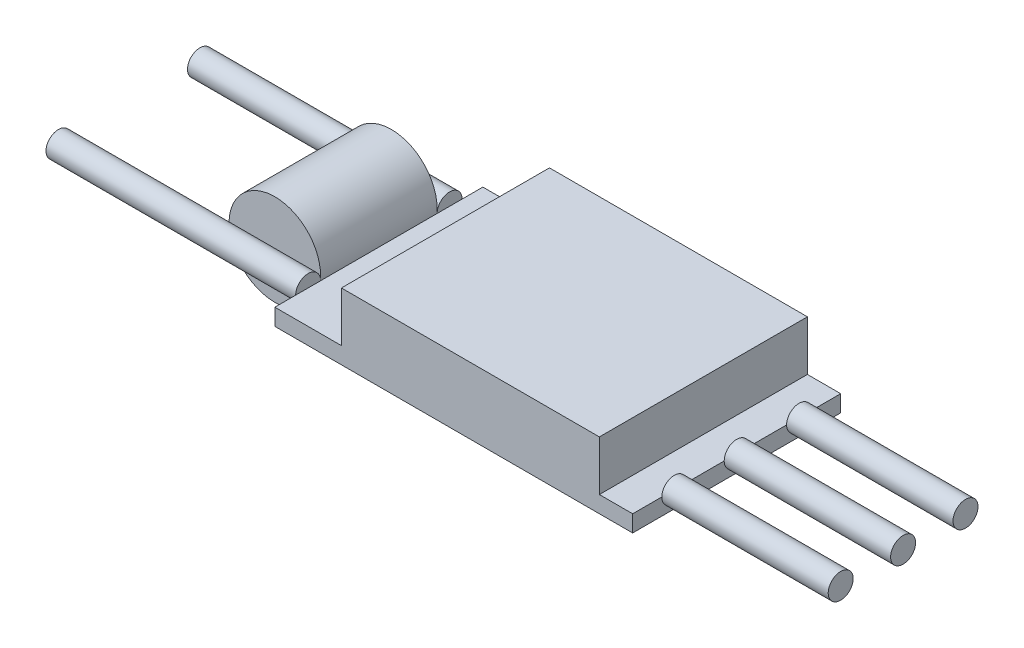
ISO-10303-21;
HEADER;
FILE_DESCRIPTION(('STEP AP214'),'2;1');
FILE_NAME('part.step','',(''),(''),'','','');
FILE_SCHEMA(('AUTOMOTIVE_DESIGN { 1 0 10303 214 1 1 1 1 }'));
ENDSEC;
DATA;
#1=APPLICATION_CONTEXT('core data for automotive mechanical design processes');
#2=APPLICATION_PROTOCOL_DEFINITION('international standard','automotive_design',2000,#1);
#3=PRODUCT_CONTEXT('',#1,'mechanical');
#4=PRODUCT('Part','Part','',(#3));
#5=PRODUCT_RELATED_PRODUCT_CATEGORY('part','',(#4));
#6=PRODUCT_DEFINITION_FORMATION('','',#4);
#7=PRODUCT_DEFINITION_CONTEXT('part definition',#1,'design');
#8=PRODUCT_DEFINITION('design','',#6,#7);
#9=PRODUCT_DEFINITION_SHAPE('','',#8);
#10=(LENGTH_UNIT() NAMED_UNIT(*) SI_UNIT(.MILLI.,.METRE.));
#11=(NAMED_UNIT(*) PLANE_ANGLE_UNIT() SI_UNIT($,.RADIAN.));
#12=(NAMED_UNIT(*) SI_UNIT($,.STERADIAN.) SOLID_ANGLE_UNIT());
#13=UNCERTAINTY_MEASURE_WITH_UNIT(LENGTH_MEASURE(1.E-05),#10,'distance_accuracy_value','');
#14=(GEOMETRIC_REPRESENTATION_CONTEXT(3) GLOBAL_UNCERTAINTY_ASSIGNED_CONTEXT((#13)) GLOBAL_UNIT_ASSIGNED_CONTEXT((#10,
#11,#12)) REPRESENTATION_CONTEXT('',''));
#15=CARTESIAN_POINT('',(0.,0.,0.));
#16=DIRECTION('',(0.,0.,1.));
#17=DIRECTION('',(1.,0.,0.));
#18=AXIS2_PLACEMENT_3D('',#15,#16,#17);
#19=CARTESIAN_POINT('',(-27.,2.5,7.));
#20=DIRECTION('',(0.,0.,-1.));
#21=DIRECTION('',(-1.,0.,0.));
#22=AXIS2_PLACEMENT_3D('',#19,#20,#21);
#23=CYLINDRICAL_SURFACE('',#22,5.5);
#24=CARTESIAN_POINT('',(-27.,2.5,7.));
#25=DIRECTION('',(0.,0.,1.));
#26=DIRECTION('',(1.,0.,0.));
#27=AXIS2_PLACEMENT_3D('',#24,#25,#26);
#28=CIRCLE('',#27,5.5);
#29=CARTESIAN_POINT('',(-21.5,2.5,7.));
#30=VERTEX_POINT('',#29);
#31=EDGE_CURVE('E11',#30,#30,#28,.T.);
#32=ORIENTED_EDGE('',*,*,#31,.F.);
#33=EDGE_LOOP('',(#32));
#34=FACE_BOUND('',#33,.T.);
#35=CARTESIAN_POINT('',(-27.,2.5,-7.));
#36=DIRECTION('',(0.,0.,1.));
#37=DIRECTION('',(1.,0.,0.));
#38=AXIS2_PLACEMENT_3D('',#35,#36,#37);
#39=CIRCLE('',#38,5.5);
#40=CARTESIAN_POINT('',(-21.5,2.5,-7.));
#41=VERTEX_POINT('',#40);
#42=EDGE_CURVE('E50',#41,#41,#39,.T.);
#43=ORIENTED_EDGE('',*,*,#42,.T.);
#44=EDGE_LOOP('',(#43));
#45=FACE_BOUND('',#44,.T.);
#46=ADVANCED_FACE('F47',(#34,#45),#23,.T.);
#47=CARTESIAN_POINT('',(-27.,2.5,7.));
#48=DIRECTION('',(0.,0.,1.));
#49=DIRECTION('',(1.,0.,0.));
#50=AXIS2_PLACEMENT_3D('',#47,#48,#49);
#51=PLANE('',#50);
#52=ORIENTED_EDGE('',*,*,#31,.T.);
#53=EDGE_LOOP('',(#52));
#54=FACE_BOUND('',#53,.T.);
#55=ADVANCED_FACE('F62',(#54),#51,.T.);
#56=CARTESIAN_POINT('',(-27.,2.5,-7.));
#57=DIRECTION('',(0.,0.,1.));
#58=DIRECTION('',(1.,0.,0.));
#59=AXIS2_PLACEMENT_3D('',#56,#57,#58);
#60=PLANE('',#59);
#61=ORIENTED_EDGE('',*,*,#42,.F.);
#62=EDGE_LOOP('',(#61));
#63=FACE_BOUND('',#62,.T.);
#64=ADVANCED_FACE('F60',(#63),#60,.F.);
#65=CLOSED_SHELL('',(#46,#55,#64));
#66=MANIFOLD_SOLID_BREP('B2',#65);
#67=CARTESIAN_POINT('',(21.5,2.,12.5));
#68=DIRECTION('',(-1.,0.,0.));
#69=DIRECTION('',(0.,0.,1.));
#70=AXIS2_PLACEMENT_3D('',#67,#68,#69);
#71=PLANE('',#70);
#72=CARTESIAN_POINT('',(21.5,2.,-7.5));
#73=DIRECTION('',(1.,0.,0.));
#74=DIRECTION('',(0.,0.,-1.));
#75=AXIS2_PLACEMENT_3D('',#72,#73,#74);
#76=CIRCLE('',#75,1.5);
#77=CARTESIAN_POINT('',(21.5,2.,-6.));
#78=VERTEX_POINT('',#77);
#79=CARTESIAN_POINT('',(21.5,2.,-9.00000000000001));
#80=VERTEX_POINT('',#79);
#81=EDGE_CURVE('E194',#78,#80,#76,.T.);
#82=ORIENTED_EDGE('',*,*,#81,.F.);
#83=DIRECTION('',(0.,0.,-1.));
#84=VECTOR('',#83,1.);
#85=CARTESIAN_POINT('',(21.5,2.,12.5));
#86=LINE('',#85,#84);
#87=CARTESIAN_POINT('',(21.5,2.,-1.5));
#88=VERTEX_POINT('',#87);
#89=EDGE_CURVE('E188',#88,#78,#86,.T.);
#90=ORIENTED_EDGE('',*,*,#89,.F.);
#91=CARTESIAN_POINT('',(21.5,2.,0.));
#92=DIRECTION('',(1.,0.,0.));
#93=DIRECTION('',(0.,0.,-1.));
#94=AXIS2_PLACEMENT_3D('',#91,#92,#93);
#95=CIRCLE('',#94,1.5);
#96=CARTESIAN_POINT('',(21.5,2.,1.5));
#97=VERTEX_POINT('',#96);
#98=EDGE_CURVE('E319',#97,#88,#95,.T.);
#99=ORIENTED_EDGE('',*,*,#98,.F.);
#100=CARTESIAN_POINT('',(21.5,2.,6.));
#101=VERTEX_POINT('',#100);
#102=EDGE_CURVE('E206',#101,#97,#86,.T.);
#103=ORIENTED_EDGE('',*,*,#102,.F.);
#104=CARTESIAN_POINT('',(21.5,2.,7.5));
#105=DIRECTION('',(1.,0.,0.));
#106=DIRECTION('',(0.,0.,-1.));
#107=AXIS2_PLACEMENT_3D('',#104,#105,#106);
#108=CIRCLE('',#107,1.5);
#109=CARTESIAN_POINT('',(21.5,2.,9.00000000000001));
#110=VERTEX_POINT('',#109);
#111=EDGE_CURVE('E45',#110,#101,#108,.T.);
#112=ORIENTED_EDGE('',*,*,#111,.F.);
#113=CARTESIAN_POINT('',(21.5,2.,12.5));
#114=VERTEX_POINT('',#113);
#115=EDGE_CURVE('E207',#114,#110,#86,.T.);
#116=ORIENTED_EDGE('',*,*,#115,.F.);
#117=DIRECTION('',(0.,-1.,0.));
#118=VECTOR('',#117,1.);
#119=CARTESIAN_POINT('',(21.5,2.,12.5));
#120=LINE('',#119,#118);
#121=CARTESIAN_POINT('',(21.5,0.,12.5));
#122=VERTEX_POINT('',#121);
#123=EDGE_CURVE('E234',#114,#122,#120,.T.);
#124=ORIENTED_EDGE('',*,*,#123,.T.);
#125=DIRECTION('',(0.,0.,-1.));
#126=VECTOR('',#125,1.);
#127=CARTESIAN_POINT('',(21.5,0.,12.5));
#128=LINE('',#127,#126);
#129=CARTESIAN_POINT('',(21.5,0.,-12.5));
#130=VERTEX_POINT('',#129);
#131=EDGE_CURVE('E245',#122,#130,#128,.T.);
#132=ORIENTED_EDGE('',*,*,#131,.T.);
#133=DIRECTION('',(0.,-1.,0.));
#134=VECTOR('',#133,1.);
#135=CARTESIAN_POINT('',(21.5,2.,-12.5));
#136=LINE('',#135,#134);
#137=CARTESIAN_POINT('',(21.5,2.,-12.5));
#138=VERTEX_POINT('',#137);
#139=EDGE_CURVE('E237',#138,#130,#136,.T.);
#140=ORIENTED_EDGE('',*,*,#139,.F.);
#141=EDGE_CURVE('E189',#80,#138,#86,.T.);
#142=ORIENTED_EDGE('',*,*,#141,.F.);
#143=EDGE_LOOP('',(#82,#90,#99,#103,#112,#116,#124,#132,#140,#142));
#144=FACE_BOUND('',#143,.T.);
#145=ADVANCED_FACE('F88',(#144),#71,.F.);
#146=CARTESIAN_POINT('',(-21.5,2.,12.5));
#147=DIRECTION('',(1.,0.,0.));
#148=DIRECTION('',(0.,0.,-1.));
#149=AXIS2_PLACEMENT_3D('',#146,#147,#148);
#150=PLANE('',#149);
#151=CARTESIAN_POINT('',(-21.5,2.,8.5));
#152=DIRECTION('',(-1.,0.,0.));
#153=DIRECTION('',(0.,0.,1.));
#154=AXIS2_PLACEMENT_3D('',#151,#152,#153);
#155=CIRCLE('',#154,1.5);
#156=CARTESIAN_POINT('',(-21.5,2.,7.));
#157=VERTEX_POINT('',#156);
#158=CARTESIAN_POINT('',(-21.5,2.,10.));
#159=VERTEX_POINT('',#158);
#160=EDGE_CURVE('E310',#157,#159,#155,.T.);
#161=ORIENTED_EDGE('',*,*,#160,.F.);
#162=DIRECTION('',(0.,0.,1.));
#163=VECTOR('',#162,1.);
#164=CARTESIAN_POINT('',(-21.5,2.,12.5));
#165=LINE('',#164,#163);
#166=CARTESIAN_POINT('',(-21.5,2.,-7.));
#167=VERTEX_POINT('',#166);
#168=EDGE_CURVE('E351',#167,#157,#165,.T.);
#169=ORIENTED_EDGE('',*,*,#168,.F.);
#170=CARTESIAN_POINT('',(-21.5,2.,-8.5));
#171=DIRECTION('',(-1.,0.,0.));
#172=DIRECTION('',(0.,0.,1.));
#173=AXIS2_PLACEMENT_3D('',#170,#171,#172);
#174=CIRCLE('',#173,1.5);
#175=CARTESIAN_POINT('',(-21.5,2.,-10.));
#176=VERTEX_POINT('',#175);
#177=EDGE_CURVE('E97',#176,#167,#174,.T.);
#178=ORIENTED_EDGE('',*,*,#177,.F.);
#179=CARTESIAN_POINT('',(-21.5,2.,-12.5));
#180=VERTEX_POINT('',#179);
#181=EDGE_CURVE('E229',#180,#176,#165,.T.);
#182=ORIENTED_EDGE('',*,*,#181,.F.);
#183=DIRECTION('',(0.,-1.,0.));
#184=VECTOR('',#183,1.);
#185=CARTESIAN_POINT('',(-21.5,2.,-12.5));
#186=LINE('',#185,#184);
#187=CARTESIAN_POINT('',(-21.5,0.,-12.5));
#188=VERTEX_POINT('',#187);
#189=EDGE_CURVE('E225',#180,#188,#186,.T.);
#190=ORIENTED_EDGE('',*,*,#189,.T.);
#191=DIRECTION('',(0.,0.,1.));
#192=VECTOR('',#191,1.);
#193=CARTESIAN_POINT('',(-21.5,0.,12.5));
#194=LINE('',#193,#192);
#195=CARTESIAN_POINT('',(-21.5,0.,12.5));
#196=VERTEX_POINT('',#195);
#197=EDGE_CURVE('E217',#188,#196,#194,.T.);
#198=ORIENTED_EDGE('',*,*,#197,.T.);
#199=DIRECTION('',(0.,-1.,0.));
#200=VECTOR('',#199,1.);
#201=CARTESIAN_POINT('',(-21.5,2.,12.5));
#202=LINE('',#201,#200);
#203=CARTESIAN_POINT('',(-21.5,2.,12.5));
#204=VERTEX_POINT('',#203);
#205=EDGE_CURVE('E231',#204,#196,#202,.T.);
#206=ORIENTED_EDGE('',*,*,#205,.F.);
#207=EDGE_CURVE('E244',#159,#204,#165,.T.);
#208=ORIENTED_EDGE('',*,*,#207,.F.);
#209=EDGE_LOOP('',(#161,#169,#178,#182,#190,#198,#206,#208));
#210=FACE_BOUND('',#209,.T.);
#211=ADVANCED_FACE('F90',(#210),#150,.F.);
#212=CARTESIAN_POINT('',(0.,2.,0.));
#213=DIRECTION('',(0.,1.,0.));
#214=DIRECTION('',(0.,0.,1.));
#215=AXIS2_PLACEMENT_3D('',#212,#213,#214);
#216=PLANE('',#215);
#217=DIRECTION('',(0.,0.,1.));
#218=VECTOR('',#217,1.);
#219=CARTESIAN_POINT('',(-13.5,2.,-12.5));
#220=LINE('',#219,#218);
#221=CARTESIAN_POINT('',(-13.5,2.,-12.5));
#222=VERTEX_POINT('',#221);
#223=CARTESIAN_POINT('',(-13.5,2.,12.5));
#224=VERTEX_POINT('',#223);
#225=EDGE_CURVE('E268',#222,#224,#220,.T.);
#226=ORIENTED_EDGE('',*,*,#225,.F.);
#227=DIRECTION('',(-1.,0.,0.));
#228=VECTOR('',#227,1.);
#229=CARTESIAN_POINT('',(21.5,2.,-12.5));
#230=LINE('',#229,#228);
#231=EDGE_CURVE('E211',#222,#180,#230,.T.);
#232=ORIENTED_EDGE('',*,*,#231,.T.);
#233=ORIENTED_EDGE('',*,*,#181,.T.);
#234=EDGE_CURVE('E350',#176,#167,#165,.T.);
#235=ORIENTED_EDGE('',*,*,#234,.T.);
#236=ORIENTED_EDGE('',*,*,#168,.T.);
#237=EDGE_CURVE('E352',#157,#159,#165,.T.);
#238=ORIENTED_EDGE('',*,*,#237,.T.);
#239=ORIENTED_EDGE('',*,*,#207,.T.);
#240=DIRECTION('',(1.,0.,0.));
#241=VECTOR('',#240,1.);
#242=CARTESIAN_POINT('',(21.5,2.,12.5));
#243=LINE('',#242,#241);
#244=EDGE_CURVE('E228',#204,#224,#243,.T.);
#245=ORIENTED_EDGE('',*,*,#244,.T.);
#246=EDGE_LOOP('',(#226,#232,#233,#235,#236,#238,#239,#245));
#247=FACE_BOUND('',#246,.T.);
#248=ADVANCED_FACE('F356',(#247),#216,.T.);
#249=CARTESIAN_POINT('',(21.5,2.,12.5));
#250=DIRECTION('',(0.,0.,-1.));
#251=DIRECTION('',(-1.,0.,0.));
#252=AXIS2_PLACEMENT_3D('',#249,#250,#251);
#253=PLANE('',#252);
#254=DIRECTION('',(1.,0.,0.));
#255=VECTOR('',#254,1.);
#256=CARTESIAN_POINT('',(21.5,0.,12.5));
#257=LINE('',#256,#255);
#258=EDGE_CURVE('E246',#196,#122,#257,.T.);
#259=ORIENTED_EDGE('',*,*,#258,.T.);
#260=ORIENTED_EDGE('',*,*,#123,.F.);
#261=CARTESIAN_POINT('',(17.5,2.,12.5));
#262=VERTEX_POINT('',#261);
#263=EDGE_CURVE('E226',#262,#114,#243,.T.);
#264=ORIENTED_EDGE('',*,*,#263,.F.);
#265=DIRECTION('',(0.,-1.,0.));
#266=VECTOR('',#265,1.);
#267=CARTESIAN_POINT('',(17.5,8.,12.5));
#268=LINE('',#267,#266);
#269=CARTESIAN_POINT('',(17.5,8.,12.5));
#270=VERTEX_POINT('',#269);
#271=EDGE_CURVE('E255',#270,#262,#268,.T.);
#272=ORIENTED_EDGE('',*,*,#271,.F.);
#273=DIRECTION('',(1.,0.,0.));
#274=VECTOR('',#273,1.);
#275=CARTESIAN_POINT('',(-13.5,8.,12.5));
#276=LINE('',#275,#274);
#277=CARTESIAN_POINT('',(-13.5,8.,12.5));
#278=VERTEX_POINT('',#277);
#279=EDGE_CURVE('E296',#278,#270,#276,.T.);
#280=ORIENTED_EDGE('',*,*,#279,.F.);
#281=DIRECTION('',(0.,-1.,0.));
#282=VECTOR('',#281,1.);
#283=CARTESIAN_POINT('',(-13.5,8.,12.5));
#284=LINE('',#283,#282);
#285=EDGE_CURVE('E250',#278,#224,#284,.T.);
#286=ORIENTED_EDGE('',*,*,#285,.T.);
#287=ORIENTED_EDGE('',*,*,#244,.F.);
#288=ORIENTED_EDGE('',*,*,#205,.T.);
#289=EDGE_LOOP('',(#259,#260,#264,#272,#280,#286,#287,#288));
#290=FACE_BOUND('',#289,.T.);
#291=ADVANCED_FACE('F384',(#290),#253,.F.);
#292=CARTESIAN_POINT('',(21.5,2.,-12.5));
#293=DIRECTION('',(0.,0.,1.));
#294=DIRECTION('',(1.,0.,0.));
#295=AXIS2_PLACEMENT_3D('',#292,#293,#294);
#296=PLANE('',#295);
#297=DIRECTION('',(-1.,0.,0.));
#298=VECTOR('',#297,1.);
#299=CARTESIAN_POINT('',(21.5,0.,-12.5));
#300=LINE('',#299,#298);
#301=EDGE_CURVE('E242',#130,#188,#300,.T.);
#302=ORIENTED_EDGE('',*,*,#301,.T.);
#303=ORIENTED_EDGE('',*,*,#189,.F.);
#304=ORIENTED_EDGE('',*,*,#231,.F.);
#305=DIRECTION('',(0.,-1.,0.));
#306=VECTOR('',#305,1.);
#307=CARTESIAN_POINT('',(-13.5,8.,-12.5));
#308=LINE('',#307,#306);
#309=CARTESIAN_POINT('',(-13.5,8.,-12.5));
#310=VERTEX_POINT('',#309);
#311=EDGE_CURVE('E272',#310,#222,#308,.T.);
#312=ORIENTED_EDGE('',*,*,#311,.F.);
#313=DIRECTION('',(-1.,0.,0.));
#314=VECTOR('',#313,1.);
#315=CARTESIAN_POINT('',(-13.5,8.,-12.5));
#316=LINE('',#315,#314);
#317=CARTESIAN_POINT('',(17.5,8.,-12.5));
#318=VERTEX_POINT('',#317);
#319=EDGE_CURVE('E276',#318,#310,#316,.T.);
#320=ORIENTED_EDGE('',*,*,#319,.F.);
#321=DIRECTION('',(0.,-1.,0.));
#322=VECTOR('',#321,1.);
#323=CARTESIAN_POINT('',(17.5,8.,-12.5));
#324=LINE('',#323,#322);
#325=CARTESIAN_POINT('',(17.5,2.,-12.5));
#326=VERTEX_POINT('',#325);
#327=EDGE_CURVE('E261',#318,#326,#324,.T.);
#328=ORIENTED_EDGE('',*,*,#327,.T.);
#329=EDGE_CURVE('E223',#138,#326,#230,.T.);
#330=ORIENTED_EDGE('',*,*,#329,.F.);
#331=ORIENTED_EDGE('',*,*,#139,.T.);
#332=EDGE_LOOP('',(#302,#303,#304,#312,#320,#328,#330,#331));
#333=FACE_BOUND('',#332,.T.);
#334=ADVANCED_FACE('F341',(#333),#296,.F.);
#335=DIRECTION('',(0.,0.,-1.));
#336=VECTOR('',#335,1.);
#337=CARTESIAN_POINT('',(17.5,2.,-12.5));
#338=LINE('',#337,#336);
#339=EDGE_CURVE('E270',#262,#326,#338,.T.);
#340=ORIENTED_EDGE('',*,*,#339,.F.);
#341=ORIENTED_EDGE('',*,*,#263,.T.);
#342=ORIENTED_EDGE('',*,*,#115,.T.);
#343=EDGE_CURVE('E212',#110,#101,#86,.T.);
#344=ORIENTED_EDGE('',*,*,#343,.T.);
#345=ORIENTED_EDGE('',*,*,#102,.T.);
#346=EDGE_CURVE('E205',#97,#88,#86,.T.);
#347=ORIENTED_EDGE('',*,*,#346,.T.);
#348=ORIENTED_EDGE('',*,*,#89,.T.);
#349=EDGE_CURVE('E184',#78,#80,#86,.T.);
#350=ORIENTED_EDGE('',*,*,#349,.T.);
#351=ORIENTED_EDGE('',*,*,#141,.T.);
#352=ORIENTED_EDGE('',*,*,#329,.T.);
#353=EDGE_LOOP('',(#340,#341,#342,#344,#345,#347,#348,#350,#351,#352));
#354=FACE_BOUND('',#353,.T.);
#355=ADVANCED_FACE('F203',(#354),#216,.T.);
#356=CARTESIAN_POINT('',(0.,0.,0.));
#357=DIRECTION('',(0.,1.,0.));
#358=DIRECTION('',(0.,0.,1.));
#359=AXIS2_PLACEMENT_3D('',#356,#357,#358);
#360=PLANE('',#359);
#361=ORIENTED_EDGE('',*,*,#197,.F.);
#362=ORIENTED_EDGE('',*,*,#301,.F.);
#363=ORIENTED_EDGE('',*,*,#131,.F.);
#364=ORIENTED_EDGE('',*,*,#258,.F.);
#365=EDGE_LOOP('',(#361,#362,#363,#364));
#366=FACE_BOUND('',#365,.T.);
#367=ADVANCED_FACE('F339',(#366),#360,.F.);
#368=CARTESIAN_POINT('',(-13.5,8.,-12.5));
#369=DIRECTION('',(1.,0.,0.));
#370=DIRECTION('',(0.,0.,-1.));
#371=AXIS2_PLACEMENT_3D('',#368,#369,#370);
#372=PLANE('',#371);
#373=ORIENTED_EDGE('',*,*,#225,.T.);
#374=ORIENTED_EDGE('',*,*,#285,.F.);
#375=DIRECTION('',(0.,0.,1.));
#376=VECTOR('',#375,1.);
#377=CARTESIAN_POINT('',(-13.5,8.,-12.5));
#378=LINE('',#377,#376);
#379=EDGE_CURVE('E281',#310,#278,#378,.T.);
#380=ORIENTED_EDGE('',*,*,#379,.F.);
#381=ORIENTED_EDGE('',*,*,#311,.T.);
#382=EDGE_LOOP('',(#373,#374,#380,#381));
#383=FACE_BOUND('',#382,.T.);
#384=ADVANCED_FACE('F398',(#383),#372,.F.);
#385=CARTESIAN_POINT('',(17.5,8.,-12.5));
#386=DIRECTION('',(-1.,0.,0.));
#387=DIRECTION('',(0.,0.,1.));
#388=AXIS2_PLACEMENT_3D('',#385,#386,#387);
#389=PLANE('',#388);
#390=ORIENTED_EDGE('',*,*,#339,.T.);
#391=ORIENTED_EDGE('',*,*,#327,.F.);
#392=DIRECTION('',(0.,0.,-1.));
#393=VECTOR('',#392,1.);
#394=CARTESIAN_POINT('',(17.5,8.,-12.5));
#395=LINE('',#394,#393);
#396=EDGE_CURVE('E293',#270,#318,#395,.T.);
#397=ORIENTED_EDGE('',*,*,#396,.F.);
#398=ORIENTED_EDGE('',*,*,#271,.T.);
#399=EDGE_LOOP('',(#390,#391,#397,#398));
#400=FACE_BOUND('',#399,.T.);
#401=ADVANCED_FACE('F402',(#400),#389,.F.);
#402=CARTESIAN_POINT('',(0.,8.,0.));
#403=DIRECTION('',(0.,1.,0.));
#404=DIRECTION('',(0.,0.,1.));
#405=AXIS2_PLACEMENT_3D('',#402,#403,#404);
#406=PLANE('',#405);
#407=ORIENTED_EDGE('',*,*,#379,.T.);
#408=ORIENTED_EDGE('',*,*,#279,.T.);
#409=ORIENTED_EDGE('',*,*,#396,.T.);
#410=ORIENTED_EDGE('',*,*,#319,.T.);
#411=EDGE_LOOP('',(#407,#408,#409,#410));
#412=FACE_BOUND('',#411,.T.);
#413=ADVANCED_FACE('F406',(#412),#406,.T.);
#414=CARTESIAN_POINT('',(-51.5,2.,-8.5));
#415=DIRECTION('',(1.,0.,0.));
#416=DIRECTION('',(0.,0.,-1.));
#417=AXIS2_PLACEMENT_3D('',#414,#415,#416);
#418=CYLINDRICAL_SURFACE('',#417,1.5);
#419=CARTESIAN_POINT('',(-51.5,2.,-8.5));
#420=DIRECTION('',(-1.,0.,0.));
#421=DIRECTION('',(0.,0.,1.));
#422=AXIS2_PLACEMENT_3D('',#419,#420,#421);
#423=CIRCLE('',#422,1.5);
#424=CARTESIAN_POINT('',(-51.5,2.,-7.));
#425=VERTEX_POINT('',#424);
#426=EDGE_CURVE('E271',#425,#425,#423,.T.);
#427=ORIENTED_EDGE('',*,*,#426,.F.);
#428=EDGE_LOOP('',(#427));
#429=FACE_BOUND('',#428,.T.);
#430=EDGE_CURVE('E301',#167,#176,#174,.T.);
#431=ORIENTED_EDGE('',*,*,#430,.T.);
#432=ORIENTED_EDGE('',*,*,#177,.T.);
#433=EDGE_LOOP('',(#431,#432));
#434=FACE_BOUND('',#433,.T.);
#435=ADVANCED_FACE('F360',(#429,#434),#418,.T.);
#436=CARTESIAN_POINT('',(-51.5,2.,-8.5));
#437=DIRECTION('',(-1.,0.,0.));
#438=DIRECTION('',(0.,0.,1.));
#439=AXIS2_PLACEMENT_3D('',#436,#437,#438);
#440=PLANE('',#439);
#441=ORIENTED_EDGE('',*,*,#426,.T.);
#442=EDGE_LOOP('',(#441));
#443=FACE_BOUND('',#442,.T.);
#444=ADVANCED_FACE('F365',(#443),#440,.T.);
#445=CARTESIAN_POINT('',(-21.5,2.,-8.5));
#446=DIRECTION('',(-1.,0.,0.));
#447=DIRECTION('',(0.,0.,1.));
#448=AXIS2_PLACEMENT_3D('',#445,#446,#447);
#449=PLANE('',#448);
#450=ORIENTED_EDGE('',*,*,#234,.F.);
#451=ORIENTED_EDGE('',*,*,#430,.F.);
#452=EDGE_LOOP('',(#450,#451));
#453=FACE_BOUND('',#452,.T.);
#454=ADVANCED_FACE('F362',(#453),#449,.F.);
#455=CARTESIAN_POINT('',(-51.5,2.,8.5));
#456=DIRECTION('',(1.,0.,0.));
#457=DIRECTION('',(0.,0.,-1.));
#458=AXIS2_PLACEMENT_3D('',#455,#456,#457);
#459=CYLINDRICAL_SURFACE('',#458,1.5);
#460=CARTESIAN_POINT('',(-51.5,2.,8.5));
#461=DIRECTION('',(-1.,0.,0.));
#462=DIRECTION('',(0.,0.,1.));
#463=AXIS2_PLACEMENT_3D('',#460,#461,#462);
#464=CIRCLE('',#463,1.5);
#465=CARTESIAN_POINT('',(-51.5,2.,10.));
#466=VERTEX_POINT('',#465);
#467=EDGE_CURVE('E304',#466,#466,#464,.T.);
#468=ORIENTED_EDGE('',*,*,#467,.F.);
#469=EDGE_LOOP('',(#468));
#470=FACE_BOUND('',#469,.T.);
#471=EDGE_CURVE('E307',#159,#157,#155,.T.);
#472=ORIENTED_EDGE('',*,*,#471,.T.);
#473=ORIENTED_EDGE('',*,*,#160,.T.);
#474=EDGE_LOOP('',(#472,#473));
#475=FACE_BOUND('',#474,.T.);
#476=ADVANCED_FACE('F364',(#470,#475),#459,.T.);
#477=CARTESIAN_POINT('',(-51.5,2.,8.5));
#478=DIRECTION('',(-1.,0.,0.));
#479=DIRECTION('',(0.,0.,1.));
#480=AXIS2_PLACEMENT_3D('',#477,#478,#479);
#481=PLANE('',#480);
#482=ORIENTED_EDGE('',*,*,#467,.T.);
#483=EDGE_LOOP('',(#482));
#484=FACE_BOUND('',#483,.T.);
#485=ADVANCED_FACE('F371',(#484),#481,.T.);
#486=CARTESIAN_POINT('',(-21.5,2.,8.5));
#487=DIRECTION('',(-1.,0.,0.));
#488=DIRECTION('',(0.,0.,1.));
#489=AXIS2_PLACEMENT_3D('',#486,#487,#488);
#490=PLANE('',#489);
#491=ORIENTED_EDGE('',*,*,#237,.F.);
#492=ORIENTED_EDGE('',*,*,#471,.F.);
#493=EDGE_LOOP('',(#491,#492));
#494=FACE_BOUND('',#493,.T.);
#495=ADVANCED_FACE('F431',(#494),#490,.F.);
#496=CARTESIAN_POINT('',(41.5,2.,7.5));
#497=DIRECTION('',(-1.,0.,0.));
#498=DIRECTION('',(0.,0.,1.));
#499=AXIS2_PLACEMENT_3D('',#496,#497,#498);
#500=CYLINDRICAL_SURFACE('',#499,1.5);
#501=CARTESIAN_POINT('',(41.5,2.,7.5));
#502=DIRECTION('',(1.,0.,0.));
#503=DIRECTION('',(0.,0.,-1.));
#504=AXIS2_PLACEMENT_3D('',#501,#502,#503);
#505=CIRCLE('',#504,1.5);
#506=CARTESIAN_POINT('',(41.5,2.,6.));
#507=VERTEX_POINT('',#506);
#508=EDGE_CURVE('E314',#507,#507,#505,.T.);
#509=ORIENTED_EDGE('',*,*,#508,.F.);
#510=EDGE_LOOP('',(#509));
#511=FACE_BOUND('',#510,.T.);
#512=EDGE_CURVE('E99',#101,#110,#108,.T.);
#513=ORIENTED_EDGE('',*,*,#512,.T.);
#514=ORIENTED_EDGE('',*,*,#111,.T.);
#515=EDGE_LOOP('',(#513,#514));
#516=FACE_BOUND('',#515,.T.);
#517=ADVANCED_FACE('F334',(#511,#516),#500,.T.);
#518=CARTESIAN_POINT('',(41.5,2.,7.5));
#519=DIRECTION('',(1.,0.,0.));
#520=DIRECTION('',(0.,0.,-1.));
#521=AXIS2_PLACEMENT_3D('',#518,#519,#520);
#522=PLANE('',#521);
#523=ORIENTED_EDGE('',*,*,#508,.T.);
#524=EDGE_LOOP('',(#523));
#525=FACE_BOUND('',#524,.T.);
#526=ADVANCED_FACE('F458',(#525),#522,.T.);
#527=CARTESIAN_POINT('',(21.5,2.,7.5));
#528=DIRECTION('',(1.,0.,0.));
#529=DIRECTION('',(0.,0.,-1.));
#530=AXIS2_PLACEMENT_3D('',#527,#528,#529);
#531=PLANE('',#530);
#532=ORIENTED_EDGE('',*,*,#343,.F.);
#533=ORIENTED_EDGE('',*,*,#512,.F.);
#534=EDGE_LOOP('',(#532,#533));
#535=FACE_BOUND('',#534,.T.);
#536=ADVANCED_FACE('F332',(#535),#531,.F.);
#537=CARTESIAN_POINT('',(41.5,2.,0.));
#538=DIRECTION('',(-1.,0.,0.));
#539=DIRECTION('',(0.,0.,1.));
#540=AXIS2_PLACEMENT_3D('',#537,#538,#539);
#541=CYLINDRICAL_SURFACE('',#540,1.5);
#542=CARTESIAN_POINT('',(41.5,2.,0.));
#543=DIRECTION('',(1.,0.,0.));
#544=DIRECTION('',(0.,0.,-1.));
#545=AXIS2_PLACEMENT_3D('',#542,#543,#544);
#546=CIRCLE('',#545,1.5);
#547=CARTESIAN_POINT('',(41.5,2.,-1.5));
#548=VERTEX_POINT('',#547);
#549=EDGE_CURVE('E315',#548,#548,#546,.T.);
#550=ORIENTED_EDGE('',*,*,#549,.F.);
#551=EDGE_LOOP('',(#550));
#552=FACE_BOUND('',#551,.T.);
#553=EDGE_CURVE('E112',#88,#97,#95,.T.);
#554=ORIENTED_EDGE('',*,*,#553,.T.);
#555=ORIENTED_EDGE('',*,*,#98,.T.);
#556=EDGE_LOOP('',(#554,#555));
#557=FACE_BOUND('',#556,.T.);
#558=ADVANCED_FACE('F326',(#552,#557),#541,.T.);
#559=CARTESIAN_POINT('',(41.5,2.,0.));
#560=DIRECTION('',(1.,0.,0.));
#561=DIRECTION('',(0.,0.,-1.));
#562=AXIS2_PLACEMENT_3D('',#559,#560,#561);
#563=PLANE('',#562);
#564=ORIENTED_EDGE('',*,*,#549,.T.);
#565=EDGE_LOOP('',(#564));
#566=FACE_BOUND('',#565,.T.);
#567=ADVANCED_FACE('F472',(#566),#563,.T.);
#568=CARTESIAN_POINT('',(21.5,2.,0.));
#569=DIRECTION('',(1.,0.,0.));
#570=DIRECTION('',(0.,0.,-1.));
#571=AXIS2_PLACEMENT_3D('',#568,#569,#570);
#572=PLANE('',#571);
#573=ORIENTED_EDGE('',*,*,#346,.F.);
#574=ORIENTED_EDGE('',*,*,#553,.F.);
#575=EDGE_LOOP('',(#573,#574));
#576=FACE_BOUND('',#575,.T.);
#577=ADVANCED_FACE('F477',(#576),#572,.F.);
#578=CARTESIAN_POINT('',(41.5,2.,-7.5));
#579=DIRECTION('',(-1.,0.,0.));
#580=DIRECTION('',(0.,0.,1.));
#581=AXIS2_PLACEMENT_3D('',#578,#579,#580);
#582=CYLINDRICAL_SURFACE('',#581,1.5);
#583=CARTESIAN_POINT('',(41.5,2.,-7.5));
#584=DIRECTION('',(1.,0.,0.));
#585=DIRECTION('',(0.,0.,-1.));
#586=AXIS2_PLACEMENT_3D('',#583,#584,#585);
#587=CIRCLE('',#586,1.5);
#588=CARTESIAN_POINT('',(41.5,2.,-9.00000000000001));
#589=VERTEX_POINT('',#588);
#590=EDGE_CURVE('E196',#589,#589,#587,.T.);
#591=ORIENTED_EDGE('',*,*,#590,.F.);
#592=EDGE_LOOP('',(#591));
#593=FACE_BOUND('',#592,.T.);
#594=EDGE_CURVE('E105',#80,#78,#76,.T.);
#595=ORIENTED_EDGE('',*,*,#594,.T.);
#596=ORIENTED_EDGE('',*,*,#81,.T.);
#597=EDGE_LOOP('',(#595,#596));
#598=FACE_BOUND('',#597,.T.);
#599=ADVANCED_FACE('F193',(#593,#598),#582,.T.);
#600=CARTESIAN_POINT('',(41.5,2.,-7.5));
#601=DIRECTION('',(1.,0.,0.));
#602=DIRECTION('',(0.,0.,-1.));
#603=AXIS2_PLACEMENT_3D('',#600,#601,#602);
#604=PLANE('',#603);
#605=ORIENTED_EDGE('',*,*,#590,.T.);
#606=EDGE_LOOP('',(#605));
#607=FACE_BOUND('',#606,.T.);
#608=ADVANCED_FACE('F445',(#607),#604,.T.);
#609=CARTESIAN_POINT('',(21.5,2.,-7.5));
#610=DIRECTION('',(1.,0.,0.));
#611=DIRECTION('',(0.,0.,-1.));
#612=AXIS2_PLACEMENT_3D('',#609,#610,#611);
#613=PLANE('',#612);
#614=ORIENTED_EDGE('',*,*,#349,.F.);
#615=ORIENTED_EDGE('',*,*,#594,.F.);
#616=EDGE_LOOP('',(#614,#615));
#617=FACE_BOUND('',#616,.T.);
#618=ADVANCED_FACE('F185',(#617),#613,.F.);
#619=CLOSED_SHELL('',(#145,#211,#248,#291,#334,#355,#367,#384,#401,#413,#435,#444,#454,#476,
#485,#495,#517,#526,#536,#558,#567,#577,#599,#608,#618));
#620=MANIFOLD_SOLID_BREP('B6',#619);
#621=ADVANCED_BREP_SHAPE_REPRESENTATION('',(#18,#66,#620),#14);
#622=SHAPE_DEFINITION_REPRESENTATION(#9,#621);
ENDSEC;
END-ISO-10303-21;
